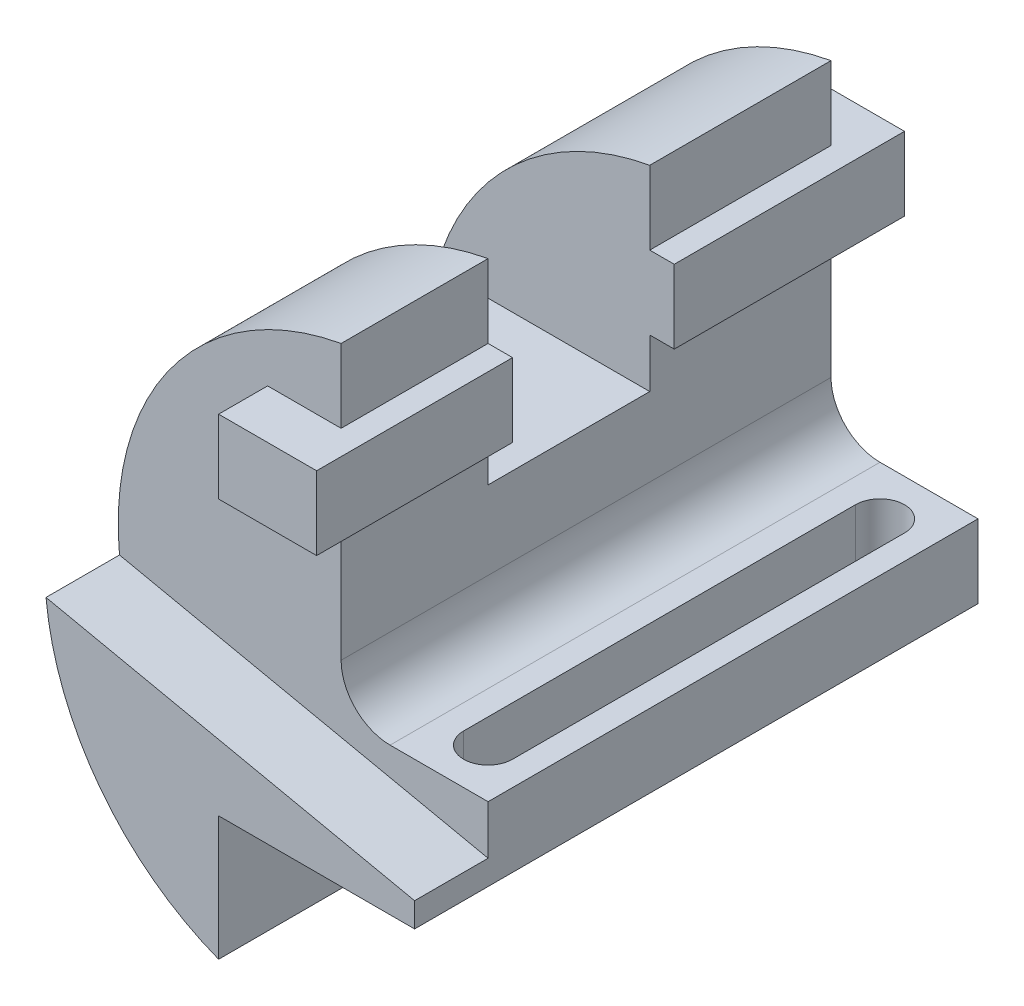
ISO-10303-21;
HEADER;
FILE_DESCRIPTION(('STEP AP214'),'2;1');
FILE_NAME('part.step','',(''),(''),'','','');
FILE_SCHEMA(('AUTOMOTIVE_DESIGN { 1 0 10303 214 1 1 1 1 }'));
ENDSEC;
DATA;
#1=APPLICATION_CONTEXT('core data for automotive mechanical design processes');
#2=APPLICATION_PROTOCOL_DEFINITION('international standard','automotive_design',2000,#1);
#3=PRODUCT_CONTEXT('',#1,'mechanical');
#4=PRODUCT('Part','Part','',(#3));
#5=PRODUCT_RELATED_PRODUCT_CATEGORY('part','',(#4));
#6=PRODUCT_DEFINITION_FORMATION('','',#4);
#7=PRODUCT_DEFINITION_CONTEXT('part definition',#1,'design');
#8=PRODUCT_DEFINITION('design','',#6,#7);
#9=PRODUCT_DEFINITION_SHAPE('','',#8);
#10=(LENGTH_UNIT() NAMED_UNIT(*) SI_UNIT(.MILLI.,.METRE.));
#11=(NAMED_UNIT(*) PLANE_ANGLE_UNIT() SI_UNIT($,.RADIAN.));
#12=(NAMED_UNIT(*) SI_UNIT($,.STERADIAN.) SOLID_ANGLE_UNIT());
#13=UNCERTAINTY_MEASURE_WITH_UNIT(LENGTH_MEASURE(1.E-05),#10,'distance_accuracy_value','');
#14=(GEOMETRIC_REPRESENTATION_CONTEXT(3) GLOBAL_UNCERTAINTY_ASSIGNED_CONTEXT((#13)) GLOBAL_UNIT_ASSIGNED_CONTEXT((#10,
#11,#12)) REPRESENTATION_CONTEXT('',''));
#15=CARTESIAN_POINT('',(0.,0.,0.));
#16=DIRECTION('',(0.,0.,1.));
#17=DIRECTION('',(1.,0.,0.));
#18=AXIS2_PLACEMENT_3D('',#15,#16,#17);
#19=CARTESIAN_POINT('',(-30.,25.0000000000001,115.));
#20=DIRECTION('',(-1.,0.,0.));
#21=DIRECTION('',(0.,0.,1.));
#22=AXIS2_PLACEMENT_3D('',#19,#20,#21);
#23=PLANE('',#22);
#24=DIRECTION('',(0.,0.,1.));
#25=VECTOR('',#24,1.);
#26=CARTESIAN_POINT('',(-30.,66.,115.));
#27=LINE('',#26,#25);
#28=CARTESIAN_POINT('',(-30.,66.,70.));
#29=VERTEX_POINT('',#28);
#30=CARTESIAN_POINT('',(-30.,66.,100.));
#31=VERTEX_POINT('',#30);
#32=EDGE_CURVE('E328',#29,#31,#27,.T.);
#33=ORIENTED_EDGE('',*,*,#32,.F.);
#34=DIRECTION('',(0.,1.,0.));
#35=VECTOR('',#34,1.);
#36=CARTESIAN_POINT('',(-30.,25.0000000000001,70.));
#37=LINE('',#36,#35);
#38=CARTESIAN_POINT('',(-30.0000000000001,81.,70.));
#39=VERTEX_POINT('',#38);
#40=EDGE_CURVE('E276',#29,#39,#37,.T.);
#41=ORIENTED_EDGE('',*,*,#40,.T.);
#42=DIRECTION('',(0.,0.,-1.));
#43=VECTOR('',#42,1.);
#44=CARTESIAN_POINT('',(-30.,81.,115.));
#45=LINE('',#44,#43);
#46=CARTESIAN_POINT('',(-30.,81.,100.));
#47=VERTEX_POINT('',#46);
#48=EDGE_CURVE('E405',#47,#39,#45,.T.);
#49=ORIENTED_EDGE('',*,*,#48,.F.);
#50=DIRECTION('',(0.,1.,0.));
#51=VECTOR('',#50,1.);
#52=CARTESIAN_POINT('',(-30.,25.0000000000001,100.));
#53=LINE('',#52,#51);
#54=EDGE_CURVE('E352',#31,#47,#53,.T.);
#55=ORIENTED_EDGE('',*,*,#54,.F.);
#56=EDGE_LOOP('',(#33,#41,#49,#55));
#57=FACE_BOUND('',#56,.T.);
#58=ADVANCED_FACE('F39',(#57),#23,.F.);
#59=CARTESIAN_POINT('',(-25.,66.,-10.));
#60=DIRECTION('',(-1.,0.,0.));
#61=DIRECTION('',(0.,-1.,0.));
#62=AXIS2_PLACEMENT_3D('',#59,#60,#61);
#63=PLANE('',#62);
#64=DIRECTION('',(0.,0.,1.));
#65=VECTOR('',#64,1.);
#66=CARTESIAN_POINT('',(-25.,51.,-10.));
#67=LINE('',#66,#65);
#68=CARTESIAN_POINT('',(-25.,51.,70.));
#69=VERTEX_POINT('',#68);
#70=CARTESIAN_POINT('',(-25.,51.,110.));
#71=VERTEX_POINT('',#70);
#72=EDGE_CURVE('E324',#69,#71,#67,.T.);
#73=ORIENTED_EDGE('',*,*,#72,.F.);
#74=DIRECTION('',(0.,1.,0.));
#75=VECTOR('',#74,1.);
#76=CARTESIAN_POINT('',(-25.,66.,70.));
#77=LINE('',#76,#75);
#78=CARTESIAN_POINT('',(-25.,66.,70.));
#79=VERTEX_POINT('',#78);
#80=EDGE_CURVE('E273',#69,#79,#77,.T.);
#81=ORIENTED_EDGE('',*,*,#80,.T.);
#82=DIRECTION('',(0.,0.,1.));
#83=VECTOR('',#82,1.);
#84=CARTESIAN_POINT('',(-25.,66.,-10.));
#85=LINE('',#84,#83);
#86=CARTESIAN_POINT('',(-25.,66.,110.));
#87=VERTEX_POINT('',#86);
#88=EDGE_CURVE('E312',#79,#87,#85,.T.);
#89=ORIENTED_EDGE('',*,*,#88,.T.);
#90=DIRECTION('',(0.,1.,0.));
#91=VECTOR('',#90,1.);
#92=CARTESIAN_POINT('',(-25.,66.,110.));
#93=LINE('',#92,#91);
#94=EDGE_CURVE('E297',#71,#87,#93,.T.);
#95=ORIENTED_EDGE('',*,*,#94,.F.);
#96=EDGE_LOOP('',(#73,#81,#89,#95));
#97=FACE_BOUND('',#96,.T.);
#98=ADVANCED_FACE('F455',(#97),#63,.F.);
#99=CARTESIAN_POINT('',(-25.,51.,-10.));
#100=DIRECTION('',(0.,1.,0.));
#101=DIRECTION('',(0.,0.,1.));
#102=AXIS2_PLACEMENT_3D('',#99,#100,#101);
#103=PLANE('',#102);
#104=DIRECTION('',(0.,0.,-1.));
#105=VECTOR('',#104,1.);
#106=CARTESIAN_POINT('',(-30.,51.,115.));
#107=LINE('',#106,#105);
#108=CARTESIAN_POINT('',(-30.,51.,100.));
#109=VERTEX_POINT('',#108);
#110=CARTESIAN_POINT('',(-30.,51.,70.));
#111=VERTEX_POINT('',#110);
#112=EDGE_CURVE('E339',#109,#111,#107,.T.);
#113=ORIENTED_EDGE('',*,*,#112,.T.);
#114=DIRECTION('',(1.,0.,0.));
#115=VECTOR('',#114,1.);
#116=CARTESIAN_POINT('',(-25.,51.,70.));
#117=LINE('',#116,#115);
#118=EDGE_CURVE('E279',#111,#69,#117,.T.);
#119=ORIENTED_EDGE('',*,*,#118,.T.);
#120=ORIENTED_EDGE('',*,*,#72,.T.);
#121=DIRECTION('',(1.,0.,0.));
#122=VECTOR('',#121,1.);
#123=CARTESIAN_POINT('',(-25.,51.,110.));
#124=LINE('',#123,#122);
#125=CARTESIAN_POINT('',(-45.,51.,110.));
#126=VERTEX_POINT('',#125);
#127=EDGE_CURVE('E300',#126,#71,#124,.T.);
#128=ORIENTED_EDGE('',*,*,#127,.F.);
#129=DIRECTION('',(0.,0.,1.));
#130=VECTOR('',#129,1.);
#131=CARTESIAN_POINT('',(-45.,51.,-10.));
#132=LINE('',#131,#130);
#133=CARTESIAN_POINT('',(-45.,51.,100.));
#134=VERTEX_POINT('',#133);
#135=EDGE_CURVE('E320',#134,#126,#132,.T.);
#136=ORIENTED_EDGE('',*,*,#135,.F.);
#137=DIRECTION('',(-1.,0.,0.));
#138=VECTOR('',#137,1.);
#139=CARTESIAN_POINT('',(-20.,51.,100.));
#140=LINE('',#139,#138);
#141=EDGE_CURVE('E420',#109,#134,#140,.T.);
#142=ORIENTED_EDGE('',*,*,#141,.F.);
#143=EDGE_LOOP('',(#113,#119,#120,#128,#136,#142));
#144=FACE_BOUND('',#143,.T.);
#145=ADVANCED_FACE('F463',(#144),#103,.F.);
#146=CARTESIAN_POINT('',(-25.,66.,-10.));
#147=DIRECTION('',(0.,-1.,0.));
#148=DIRECTION('',(0.,0.,-1.));
#149=AXIS2_PLACEMENT_3D('',#146,#147,#148);
#150=PLANE('',#149);
#151=ORIENTED_EDGE('',*,*,#88,.F.);
#152=DIRECTION('',(-1.,0.,0.));
#153=VECTOR('',#152,1.);
#154=CARTESIAN_POINT('',(-25.,66.,70.));
#155=LINE('',#154,#153);
#156=EDGE_CURVE('E426',#79,#29,#155,.T.);
#157=ORIENTED_EDGE('',*,*,#156,.T.);
#158=ORIENTED_EDGE('',*,*,#32,.T.);
#159=DIRECTION('',(1.,0.,0.));
#160=VECTOR('',#159,1.);
#161=CARTESIAN_POINT('',(-20.,66.,100.));
#162=LINE('',#161,#160);
#163=CARTESIAN_POINT('',(-45.,66.,100.));
#164=VERTEX_POINT('',#163);
#165=EDGE_CURVE('E414',#164,#31,#162,.T.);
#166=ORIENTED_EDGE('',*,*,#165,.F.);
#167=DIRECTION('',(0.,0.,1.));
#168=VECTOR('',#167,1.);
#169=CARTESIAN_POINT('',(-45.,66.,-10.));
#170=LINE('',#169,#168);
#171=CARTESIAN_POINT('',(-45.,66.,110.));
#172=VERTEX_POINT('',#171);
#173=EDGE_CURVE('E316',#164,#172,#170,.T.);
#174=ORIENTED_EDGE('',*,*,#173,.T.);
#175=DIRECTION('',(-1.,0.,0.));
#176=VECTOR('',#175,1.);
#177=CARTESIAN_POINT('',(-25.,66.,110.));
#178=LINE('',#177,#176);
#179=EDGE_CURVE('E294',#87,#172,#178,.T.);
#180=ORIENTED_EDGE('',*,*,#179,.F.);
#181=EDGE_LOOP('',(#151,#157,#158,#166,#174,#180));
#182=FACE_BOUND('',#181,.T.);
#183=ADVANCED_FACE('F474',(#182),#150,.F.);
#184=DIRECTION('',(0.,0.,1.));
#185=VECTOR('',#184,1.);
#186=CARTESIAN_POINT('',(-30.,41.,115.));
#187=LINE('',#186,#185);
#188=CARTESIAN_POINT('',(-30.,41.,37.));
#189=VERTEX_POINT('',#188);
#190=CARTESIAN_POINT('',(-30.,41.,70.));
#191=VERTEX_POINT('',#190);
#192=EDGE_CURVE('E288',#189,#191,#187,.T.);
#193=ORIENTED_EDGE('',*,*,#192,.T.);
#194=DIRECTION('',(0.,1.,0.));
#195=VECTOR('',#194,1.);
#196=CARTESIAN_POINT('',(-30.,25.0000000000001,70.));
#197=LINE('',#196,#195);
#198=EDGE_CURVE('E285',#191,#111,#197,.T.);
#199=ORIENTED_EDGE('',*,*,#198,.T.);
#200=ORIENTED_EDGE('',*,*,#112,.F.);
#201=CARTESIAN_POINT('',(-30.,25.0000000000001,100.));
#202=VERTEX_POINT('',#201);
#203=EDGE_CURVE('E353',#202,#109,#53,.T.);
#204=ORIENTED_EDGE('',*,*,#203,.F.);
#205=DIRECTION('',(0.,0.,-1.));
#206=VECTOR('',#205,1.);
#207=CARTESIAN_POINT('',(-30.,25.0000000000001,115.));
#208=LINE('',#207,#206);
#209=CARTESIAN_POINT('',(-30.,25.0000000000001,0.));
#210=VERTEX_POINT('',#209);
#211=EDGE_CURVE('E408',#202,#210,#208,.T.);
#212=ORIENTED_EDGE('',*,*,#211,.T.);
#213=DIRECTION('',(0.,1.,0.));
#214=VECTOR('',#213,1.);
#215=CARTESIAN_POINT('',(-30.,25.0000000000001,0.));
#216=LINE('',#215,#214);
#217=CARTESIAN_POINT('',(-30.,51.,0.));
#218=VERTEX_POINT('',#217);
#219=EDGE_CURVE('E388',#210,#218,#216,.T.);
#220=ORIENTED_EDGE('',*,*,#219,.T.);
#221=CARTESIAN_POINT('',(-30.,51.,37.));
#222=VERTEX_POINT('',#221);
#223=EDGE_CURVE('E338',#222,#218,#107,.T.);
#224=ORIENTED_EDGE('',*,*,#223,.F.);
#225=DIRECTION('',(0.,-1.,0.));
#226=VECTOR('',#225,1.);
#227=CARTESIAN_POINT('',(-30.,25.0000000000001,37.));
#228=LINE('',#227,#226);
#229=EDGE_CURVE('E270',#222,#189,#228,.T.);
#230=ORIENTED_EDGE('',*,*,#229,.T.);
#231=EDGE_LOOP('',(#193,#199,#200,#204,#212,#220,#224,#230));
#232=FACE_BOUND('',#231,.T.);
#233=ADVANCED_FACE('F459',(#232),#23,.F.);
#234=CARTESIAN_POINT('',(-30.0000000000001,81.,37.));
#235=VERTEX_POINT('',#234);
#236=CARTESIAN_POINT('',(-30.,81.,0.));
#237=VERTEX_POINT('',#236);
#238=EDGE_CURVE('E404',#235,#237,#45,.T.);
#239=ORIENTED_EDGE('',*,*,#238,.F.);
#240=DIRECTION('',(0.,-1.,0.));
#241=VECTOR('',#240,1.);
#242=CARTESIAN_POINT('',(-30.,25.0000000000001,37.));
#243=LINE('',#242,#241);
#244=CARTESIAN_POINT('',(-30.,66.,37.));
#245=VERTEX_POINT('',#244);
#246=EDGE_CURVE('E261',#235,#245,#243,.T.);
#247=ORIENTED_EDGE('',*,*,#246,.T.);
#248=CARTESIAN_POINT('',(-30.,66.,0.));
#249=VERTEX_POINT('',#248);
#250=EDGE_CURVE('E329',#249,#245,#27,.T.);
#251=ORIENTED_EDGE('',*,*,#250,.F.);
#252=EDGE_CURVE('E387',#249,#237,#216,.T.);
#253=ORIENTED_EDGE('',*,*,#252,.T.);
#254=EDGE_LOOP('',(#239,#247,#251,#253));
#255=FACE_BOUND('',#254,.T.);
#256=ADVANCED_FACE('F458',(#255),#23,.F.);
#257=CARTESIAN_POINT('',(-20.,25.,0.));
#258=DIRECTION('',(0.,0.,-1.));
#259=DIRECTION('',(-1.,0.,0.));
#260=AXIS2_PLACEMENT_3D('',#257,#258,#259);
#261=PLANE('',#260);
#262=DIRECTION('',(0.,-1.,0.));
#263=VECTOR('',#262,1.);
#264=CARTESIAN_POINT('',(-45.,25.,0.));
#265=LINE('',#264,#263);
#266=CARTESIAN_POINT('',(-45.,66.,0.));
#267=VERTEX_POINT('',#266);
#268=CARTESIAN_POINT('',(-45.,51.,0.));
#269=VERTEX_POINT('',#268);
#270=EDGE_CURVE('E335',#267,#269,#265,.T.);
#271=ORIENTED_EDGE('',*,*,#270,.T.);
#272=DIRECTION('',(1.,0.,0.));
#273=VECTOR('',#272,1.);
#274=CARTESIAN_POINT('',(-20.,51.,0.));
#275=LINE('',#274,#273);
#276=EDGE_CURVE('E342',#269,#218,#275,.T.);
#277=ORIENTED_EDGE('',*,*,#276,.T.);
#278=ORIENTED_EDGE('',*,*,#219,.F.);
#279=CARTESIAN_POINT('',(-20.,25.,0.));
#280=DIRECTION('',(0.,0.,-1.));
#281=DIRECTION('',(-1.,0.,0.));
#282=AXIS2_PLACEMENT_3D('',#279,#280,#281);
#283=CIRCLE('',#282,10.);
#284=CARTESIAN_POINT('',(-19.9999999999999,15.,0.));
#285=VERTEX_POINT('',#284);
#286=EDGE_CURVE('E384',#285,#210,#283,.T.);
#287=ORIENTED_EDGE('',*,*,#286,.F.);
#288=DIRECTION('',(-1.,0.,0.));
#289=VECTOR('',#288,1.);
#290=CARTESIAN_POINT('',(0.,15.,0.));
#291=LINE('',#290,#289);
#292=CARTESIAN_POINT('',(0.,15.,0.));
#293=VERTEX_POINT('',#292);
#294=EDGE_CURVE('E381',#293,#285,#291,.T.);
#295=ORIENTED_EDGE('',*,*,#294,.F.);
#296=DIRECTION('',(0.,1.,0.));
#297=VECTOR('',#296,1.);
#298=CARTESIAN_POINT('',(0.,0.,0.));
#299=LINE('',#298,#297);
#300=CARTESIAN_POINT('',(0.,0.,0.));
#301=VERTEX_POINT('',#300);
#302=EDGE_CURVE('E366',#301,#293,#299,.T.);
#303=ORIENTED_EDGE('',*,*,#302,.F.);
#304=DIRECTION('',(1.,0.,0.));
#305=VECTOR('',#304,1.);
#306=CARTESIAN_POINT('',(0.,0.,0.));
#307=LINE('',#306,#305);
#308=CARTESIAN_POINT('',(-40.,0.,0.));
#309=VERTEX_POINT('',#308);
#310=EDGE_CURVE('E372',#309,#301,#307,.T.);
#311=ORIENTED_EDGE('',*,*,#310,.F.);
#312=DIRECTION('',(0.,1.,0.));
#313=VECTOR('',#312,1.);
#314=CARTESIAN_POINT('',(-40.,0.,0.));
#315=LINE('',#314,#313);
#316=CARTESIAN_POINT('',(-40.,-25.3627969821569,0.));
#317=VERTEX_POINT('',#316);
#318=EDGE_CURVE('E393',#317,#309,#315,.T.);
#319=ORIENTED_EDGE('',*,*,#318,.F.);
#320=CARTESIAN_POINT('',(-20.,26.4083339693685,0.));
#321=DIRECTION('',(0.,0.,1.));
#322=DIRECTION('',(-1.,0.,0.));
#323=AXIS2_PLACEMENT_3D('',#320,#321,#322);
#324=CIRCLE('',#323,55.5);
#325=EDGE_CURVE('E391',#237,#317,#324,.T.);
#326=ORIENTED_EDGE('',*,*,#325,.F.);
#327=ORIENTED_EDGE('',*,*,#252,.F.);
#328=DIRECTION('',(-1.,0.,0.));
#329=VECTOR('',#328,1.);
#330=CARTESIAN_POINT('',(-20.,66.,0.));
#331=LINE('',#330,#329);
#332=EDGE_CURVE('E332',#249,#267,#331,.T.);
#333=ORIENTED_EDGE('',*,*,#332,.T.);
#334=EDGE_LOOP('',(#271,#277,#278,#287,#295,#303,#311,#319,#326,#327,#333));
#335=FACE_BOUND('',#334,.T.);
#336=ADVANCED_FACE('F471',(#335),#261,.T.);
#337=CARTESIAN_POINT('',(-20.,25.,100.));
#338=DIRECTION('',(0.,0.,1.));
#339=DIRECTION('',(1.,0.,0.));
#340=AXIS2_PLACEMENT_3D('',#337,#338,#339);
#341=PLANE('',#340);
#342=ORIENTED_EDGE('',*,*,#203,.T.);
#343=ORIENTED_EDGE('',*,*,#141,.T.);
#344=DIRECTION('',(0.,1.,0.));
#345=VECTOR('',#344,1.);
#346=CARTESIAN_POINT('',(-45.,25.,100.));
#347=LINE('',#346,#345);
#348=EDGE_CURVE('E417',#134,#164,#347,.T.);
#349=ORIENTED_EDGE('',*,*,#348,.T.);
#350=ORIENTED_EDGE('',*,*,#165,.T.);
#351=ORIENTED_EDGE('',*,*,#54,.T.);
#352=CARTESIAN_POINT('',(-20.,26.4083339693685,100.));
#353=DIRECTION('',(0.,0.,1.));
#354=DIRECTION('',(1.,0.,0.));
#355=AXIS2_PLACEMENT_3D('',#352,#353,#354);
#356=CIRCLE('',#355,55.5);
#357=CARTESIAN_POINT('',(-75.2350441418964,20.9917022998936,100.));
#358=VERTEX_POINT('',#357);
#359=EDGE_CURVE('E356',#47,#358,#356,.T.);
#360=ORIENTED_EDGE('',*,*,#359,.T.);
#361=DIRECTION('',(0.978147600733806,-0.207911690817756,0.));
#362=VECTOR('',#361,1.);
#363=CARTESIAN_POINT('',(0.,4.99999999999999,100.));
#364=LINE('',#363,#362);
#365=CARTESIAN_POINT('',(0.,4.99999999999999,100.));
#366=VERTEX_POINT('',#365);
#367=EDGE_CURVE('E358',#358,#366,#364,.T.);
#368=ORIENTED_EDGE('',*,*,#367,.T.);
#369=DIRECTION('',(0.,1.,0.));
#370=VECTOR('',#369,1.);
#371=CARTESIAN_POINT('',(0.,4.99999999999999,100.));
#372=LINE('',#371,#370);
#373=CARTESIAN_POINT('',(0.,15.,100.));
#374=VERTEX_POINT('',#373);
#375=EDGE_CURVE('E346',#366,#374,#372,.T.);
#376=ORIENTED_EDGE('',*,*,#375,.T.);
#377=DIRECTION('',(-1.,0.,0.));
#378=VECTOR('',#377,1.);
#379=CARTESIAN_POINT('',(0.,15.,100.));
#380=LINE('',#379,#378);
#381=CARTESIAN_POINT('',(-19.9999999999999,15.,100.));
#382=VERTEX_POINT('',#381);
#383=EDGE_CURVE('E348',#374,#382,#380,.T.);
#384=ORIENTED_EDGE('',*,*,#383,.T.);
#385=CARTESIAN_POINT('',(-20.,25.,100.));
#386=DIRECTION('',(0.,0.,-1.));
#387=DIRECTION('',(1.,0.,0.));
#388=AXIS2_PLACEMENT_3D('',#385,#386,#387);
#389=CIRCLE('',#388,10.);
#390=EDGE_CURVE('E350',#382,#202,#389,.T.);
#391=ORIENTED_EDGE('',*,*,#390,.T.);
#392=EDGE_LOOP('',(#342,#343,#349,#350,#351,#360,#368,#376,#384,#391));
#393=FACE_BOUND('',#392,.T.);
#394=ADVANCED_FACE('F517',(#393),#341,.T.);
#395=CARTESIAN_POINT('',(0.,15.,115.));
#396=DIRECTION('',(0.,-1.,0.));
#397=DIRECTION('',(1.,0.,0.));
#398=AXIS2_PLACEMENT_3D('',#395,#396,#397);
#399=PLANE('',#398);
#400=DIRECTION('',(0.,0.,1.));
#401=VECTOR('',#400,1.);
#402=CARTESIAN_POINT('',(-15.,15.,10.));
#403=LINE('',#402,#401);
#404=CARTESIAN_POINT('',(-15.,15.,10.));
#405=VERTEX_POINT('',#404);
#406=CARTESIAN_POINT('',(-15.,15.,90.));
#407=VERTEX_POINT('',#406);
#408=EDGE_CURVE('E236',#405,#407,#403,.T.);
#409=ORIENTED_EDGE('',*,*,#408,.F.);
#410=CARTESIAN_POINT('',(-10.,15.,10.));
#411=DIRECTION('',(0.,1.,0.));
#412=DIRECTION('',(-1.,0.,0.));
#413=AXIS2_PLACEMENT_3D('',#410,#411,#412);
#414=CIRCLE('',#413,5.);
#415=CARTESIAN_POINT('',(-5.,15.,10.));
#416=VERTEX_POINT('',#415);
#417=EDGE_CURVE('E54',#416,#405,#414,.T.);
#418=ORIENTED_EDGE('',*,*,#417,.F.);
#419=DIRECTION('',(0.,0.,-1.));
#420=VECTOR('',#419,1.);
#421=CARTESIAN_POINT('',(-5.,15.,10.));
#422=LINE('',#421,#420);
#423=CARTESIAN_POINT('',(-4.99999999999999,15.,90.));
#424=VERTEX_POINT('',#423);
#425=EDGE_CURVE('E243',#424,#416,#422,.T.);
#426=ORIENTED_EDGE('',*,*,#425,.F.);
#427=CARTESIAN_POINT('',(-9.99999999999999,15.,90.));
#428=DIRECTION('',(0.,1.,0.));
#429=DIRECTION('',(-1.,0.,0.));
#430=AXIS2_PLACEMENT_3D('',#427,#428,#429);
#431=CIRCLE('',#430,5.);
#432=EDGE_CURVE('E227',#407,#424,#431,.T.);
#433=ORIENTED_EDGE('',*,*,#432,.F.);
#434=EDGE_LOOP('',(#409,#418,#426,#433));
#435=FACE_BOUND('',#434,.T.);
#436=ORIENTED_EDGE('',*,*,#383,.F.);
#437=DIRECTION('',(0.,0.,-1.));
#438=VECTOR('',#437,1.);
#439=CARTESIAN_POINT('',(0.,15.,115.));
#440=LINE('',#439,#438);
#441=EDGE_CURVE('E412',#374,#293,#440,.T.);
#442=ORIENTED_EDGE('',*,*,#441,.T.);
#443=ORIENTED_EDGE('',*,*,#294,.T.);
#444=DIRECTION('',(0.,0.,-1.));
#445=VECTOR('',#444,1.);
#446=CARTESIAN_POINT('',(-19.9999999999999,15.,115.));
#447=LINE('',#446,#445);
#448=EDGE_CURVE('E410',#382,#285,#447,.T.);
#449=ORIENTED_EDGE('',*,*,#448,.F.);
#450=EDGE_LOOP('',(#436,#442,#443,#449));
#451=FACE_BOUND('',#450,.T.);
#452=ADVANCED_FACE('F240',(#435,#451),#399,.F.);
#453=CARTESIAN_POINT('',(-20.,25.,115.));
#454=DIRECTION('',(0.,0.,-1.));
#455=DIRECTION('',(-1.,0.,0.));
#456=AXIS2_PLACEMENT_3D('',#453,#454,#455);
#457=CYLINDRICAL_SURFACE('',#456,10.);
#458=ORIENTED_EDGE('',*,*,#390,.F.);
#459=ORIENTED_EDGE('',*,*,#448,.T.);
#460=ORIENTED_EDGE('',*,*,#286,.T.);
#461=ORIENTED_EDGE('',*,*,#211,.F.);
#462=EDGE_LOOP('',(#458,#459,#460,#461));
#463=FACE_BOUND('',#462,.T.);
#464=ADVANCED_FACE('F530',(#463),#457,.F.);
#465=CARTESIAN_POINT('',(0.,0.,115.));
#466=DIRECTION('',(-1.,0.,0.));
#467=DIRECTION('',(0.,0.,1.));
#468=AXIS2_PLACEMENT_3D('',#465,#466,#467);
#469=PLANE('',#468);
#470=ORIENTED_EDGE('',*,*,#375,.F.);
#471=DIRECTION('',(0.,0.,1.));
#472=VECTOR('',#471,1.);
#473=CARTESIAN_POINT('',(0.,4.99999999999999,100.));
#474=LINE('',#473,#472);
#475=CARTESIAN_POINT('',(0.,4.99999999999999,115.));
#476=VERTEX_POINT('',#475);
#477=EDGE_CURVE('E363',#366,#476,#474,.T.);
#478=ORIENTED_EDGE('',*,*,#477,.T.);
#479=DIRECTION('',(0.,1.,0.));
#480=VECTOR('',#479,1.);
#481=CARTESIAN_POINT('',(0.,0.,115.));
#482=LINE('',#481,#480);
#483=CARTESIAN_POINT('',(0.,0.,115.));
#484=VERTEX_POINT('',#483);
#485=EDGE_CURVE('E368',#484,#476,#482,.T.);
#486=ORIENTED_EDGE('',*,*,#485,.F.);
#487=DIRECTION('',(0.,0.,-1.));
#488=VECTOR('',#487,1.);
#489=CARTESIAN_POINT('',(0.,0.,115.));
#490=LINE('',#489,#488);
#491=EDGE_CURVE('E378',#484,#301,#490,.T.);
#492=ORIENTED_EDGE('',*,*,#491,.T.);
#493=ORIENTED_EDGE('',*,*,#302,.T.);
#494=ORIENTED_EDGE('',*,*,#441,.F.);
#495=EDGE_LOOP('',(#470,#478,#486,#492,#493,#494));
#496=FACE_BOUND('',#495,.T.);
#497=ADVANCED_FACE('F41',(#496),#469,.F.);
#498=CARTESIAN_POINT('',(-20.,26.4083339693685,115.));
#499=DIRECTION('',(0.,0.,-1.));
#500=DIRECTION('',(-1.,0.,0.));
#501=AXIS2_PLACEMENT_3D('',#498,#499,#500);
#502=CYLINDRICAL_SURFACE('',#501,55.5);
#503=ORIENTED_EDGE('',*,*,#48,.T.);
#504=CARTESIAN_POINT('',(-20.,26.4083339693685,70.));
#505=DIRECTION('',(0.,0.,1.));
#506=DIRECTION('',(1.,0.,0.));
#507=AXIS2_PLACEMENT_3D('',#504,#505,#506);
#508=CIRCLE('',#507,55.5);
#509=CARTESIAN_POINT('',(-73.5474862383895,41.,70.));
#510=VERTEX_POINT('',#509);
#511=EDGE_CURVE('E282',#39,#510,#508,.T.);
#512=ORIENTED_EDGE('',*,*,#511,.T.);
#513=DIRECTION('',(0.,0.,-1.));
#514=VECTOR('',#513,1.);
#515=CARTESIAN_POINT('',(-73.5474862383895,41.,115.));
#516=LINE('',#515,#514);
#517=CARTESIAN_POINT('',(-73.5474862383895,41.,37.));
#518=VERTEX_POINT('',#517);
#519=EDGE_CURVE('E429',#510,#518,#516,.T.);
#520=ORIENTED_EDGE('',*,*,#519,.T.);
#521=CARTESIAN_POINT('',(-20.,26.4083339693685,37.));
#522=DIRECTION('',(0.,0.,-1.));
#523=DIRECTION('',(0.,1.,0.));
#524=AXIS2_PLACEMENT_3D('',#521,#522,#523);
#525=CIRCLE('',#524,55.5);
#526=EDGE_CURVE('E267',#518,#235,#525,.T.);
#527=ORIENTED_EDGE('',*,*,#526,.T.);
#528=ORIENTED_EDGE('',*,*,#238,.T.);
#529=ORIENTED_EDGE('',*,*,#325,.T.);
#530=DIRECTION('',(0.,0.,-1.));
#531=VECTOR('',#530,1.);
#532=CARTESIAN_POINT('',(-40.,-25.3627969821569,115.));
#533=LINE('',#532,#531);
#534=CARTESIAN_POINT('',(-40.,-25.3627969821569,115.));
#535=VERTEX_POINT('',#534);
#536=EDGE_CURVE('E401',#535,#317,#533,.T.);
#537=ORIENTED_EDGE('',*,*,#536,.F.);
#538=CARTESIAN_POINT('',(-20.,26.4083339693685,115.));
#539=DIRECTION('',(0.,0.,1.));
#540=DIRECTION('',(-1.,0.,0.));
#541=AXIS2_PLACEMENT_3D('',#538,#539,#540);
#542=CIRCLE('',#541,55.5);
#543=CARTESIAN_POINT('',(-75.2350441418964,20.9917022998936,115.));
#544=VERTEX_POINT('',#543);
#545=EDGE_CURVE('E371',#544,#535,#542,.T.);
#546=ORIENTED_EDGE('',*,*,#545,.F.);
#547=DIRECTION('',(0.,0.,1.));
#548=VECTOR('',#547,1.);
#549=CARTESIAN_POINT('',(-75.2350441418964,20.9917022998936,100.));
#550=LINE('',#549,#548);
#551=EDGE_CURVE('E361',#358,#544,#550,.T.);
#552=ORIENTED_EDGE('',*,*,#551,.F.);
#553=ORIENTED_EDGE('',*,*,#359,.F.);
#554=EDGE_LOOP('',(#503,#512,#520,#527,#528,#529,#537,#546,#552,#553));
#555=FACE_BOUND('',#554,.T.);
#556=ADVANCED_FACE('F490',(#555),#502,.T.);
#557=CARTESIAN_POINT('',(-40.,0.,115.));
#558=DIRECTION('',(-1.,0.,0.));
#559=DIRECTION('',(0.,-1.,0.));
#560=AXIS2_PLACEMENT_3D('',#557,#558,#559);
#561=PLANE('',#560);
#562=ORIENTED_EDGE('',*,*,#318,.T.);
#563=DIRECTION('',(0.,0.,-1.));
#564=VECTOR('',#563,1.);
#565=CARTESIAN_POINT('',(-40.,0.,115.));
#566=LINE('',#565,#564);
#567=CARTESIAN_POINT('',(-40.,0.,115.));
#568=VERTEX_POINT('',#567);
#569=EDGE_CURVE('E398',#568,#309,#566,.T.);
#570=ORIENTED_EDGE('',*,*,#569,.F.);
#571=DIRECTION('',(0.,1.,0.));
#572=VECTOR('',#571,1.);
#573=CARTESIAN_POINT('',(-40.,0.,115.));
#574=LINE('',#573,#572);
#575=EDGE_CURVE('E374',#535,#568,#574,.T.);
#576=ORIENTED_EDGE('',*,*,#575,.F.);
#577=ORIENTED_EDGE('',*,*,#536,.T.);
#578=EDGE_LOOP('',(#562,#570,#576,#577));
#579=FACE_BOUND('',#578,.T.);
#580=ADVANCED_FACE('F502',(#579),#561,.F.);
#581=CARTESIAN_POINT('',(0.,0.,115.));
#582=DIRECTION('',(0.,1.,0.));
#583=DIRECTION('',(-1.,0.,0.));
#584=AXIS2_PLACEMENT_3D('',#581,#582,#583);
#585=PLANE('',#584);
#586=DIRECTION('',(0.,0.,-1.));
#587=VECTOR('',#586,1.);
#588=CARTESIAN_POINT('',(-4.99999999999999,0.,115.));
#589=LINE('',#588,#587);
#590=CARTESIAN_POINT('',(-4.99999999999999,0.,90.));
#591=VERTEX_POINT('',#590);
#592=CARTESIAN_POINT('',(-5.,0.,10.));
#593=VERTEX_POINT('',#592);
#594=EDGE_CURVE('E47',#591,#593,#589,.T.);
#595=ORIENTED_EDGE('',*,*,#594,.T.);
#596=CARTESIAN_POINT('',(-10.,0.,10.));
#597=DIRECTION('',(0.,1.,0.));
#598=DIRECTION('',(-1.,0.,0.));
#599=AXIS2_PLACEMENT_3D('',#596,#597,#598);
#600=CIRCLE('',#599,5.);
#601=CARTESIAN_POINT('',(-15.,0.,10.));
#602=VERTEX_POINT('',#601);
#603=EDGE_CURVE('E12',#593,#602,#600,.T.);
#604=ORIENTED_EDGE('',*,*,#603,.T.);
#605=DIRECTION('',(0.,0.,1.));
#606=VECTOR('',#605,1.);
#607=CARTESIAN_POINT('',(-15.,0.,115.));
#608=LINE('',#607,#606);
#609=CARTESIAN_POINT('',(-15.,0.,90.));
#610=VERTEX_POINT('',#609);
#611=EDGE_CURVE('E432',#602,#610,#608,.T.);
#612=ORIENTED_EDGE('',*,*,#611,.T.);
#613=CARTESIAN_POINT('',(-9.99999999999999,0.,90.));
#614=DIRECTION('',(0.,1.,0.));
#615=DIRECTION('',(-1.,0.,0.));
#616=AXIS2_PLACEMENT_3D('',#613,#614,#615);
#617=CIRCLE('',#616,5.);
#618=EDGE_CURVE('E230',#610,#591,#617,.T.);
#619=ORIENTED_EDGE('',*,*,#618,.T.);
#620=EDGE_LOOP('',(#595,#604,#612,#619));
#621=FACE_BOUND('',#620,.T.);
#622=ORIENTED_EDGE('',*,*,#310,.T.);
#623=ORIENTED_EDGE('',*,*,#491,.F.);
#624=DIRECTION('',(1.,0.,0.));
#625=VECTOR('',#624,1.);
#626=CARTESIAN_POINT('',(0.,0.,115.));
#627=LINE('',#626,#625);
#628=EDGE_CURVE('E376',#568,#484,#627,.T.);
#629=ORIENTED_EDGE('',*,*,#628,.F.);
#630=ORIENTED_EDGE('',*,*,#569,.T.);
#631=EDGE_LOOP('',(#622,#623,#629,#630));
#632=FACE_BOUND('',#631,.T.);
#633=ADVANCED_FACE('F436',(#621,#632),#585,.F.);
#634=CARTESIAN_POINT('',(-20.,25.,115.));
#635=DIRECTION('',(0.,0.,-1.));
#636=DIRECTION('',(-1.,0.,0.));
#637=AXIS2_PLACEMENT_3D('',#634,#635,#636);
#638=PLANE('',#637);
#639=ORIENTED_EDGE('',*,*,#485,.T.);
#640=DIRECTION('',(0.978147600733806,-0.207911690817756,0.));
#641=VECTOR('',#640,1.);
#642=CARTESIAN_POINT('',(0.,4.99999999999999,115.));
#643=LINE('',#642,#641);
#644=EDGE_CURVE('E345',#544,#476,#643,.T.);
#645=ORIENTED_EDGE('',*,*,#644,.F.);
#646=ORIENTED_EDGE('',*,*,#545,.T.);
#647=ORIENTED_EDGE('',*,*,#575,.T.);
#648=ORIENTED_EDGE('',*,*,#628,.T.);
#649=EDGE_LOOP('',(#639,#645,#646,#647,#648));
#650=FACE_BOUND('',#649,.T.);
#651=ADVANCED_FACE('F506',(#650),#638,.F.);
#652=CARTESIAN_POINT('',(0.,4.99999999999999,100.));
#653=DIRECTION('',(-0.207911690817756,-0.978147600733806,0.));
#654=DIRECTION('',(0.978147600733806,-0.207911690817756,0.));
#655=AXIS2_PLACEMENT_3D('',#652,#653,#654);
#656=PLANE('',#655);
#657=ORIENTED_EDGE('',*,*,#644,.T.);
#658=ORIENTED_EDGE('',*,*,#477,.F.);
#659=ORIENTED_EDGE('',*,*,#367,.F.);
#660=ORIENTED_EDGE('',*,*,#551,.T.);
#661=EDGE_LOOP('',(#657,#658,#659,#660));
#662=FACE_BOUND('',#661,.T.);
#663=ADVANCED_FACE('F514',(#662),#656,.F.);
#664=CARTESIAN_POINT('',(-45.,66.,-10.));
#665=DIRECTION('',(1.,0.,0.));
#666=DIRECTION('',(0.,0.,-1.));
#667=AXIS2_PLACEMENT_3D('',#664,#665,#666);
#668=PLANE('',#667);
#669=ORIENTED_EDGE('',*,*,#270,.F.);
#670=CARTESIAN_POINT('',(-45.,66.,-10.));
#671=VERTEX_POINT('',#670);
#672=EDGE_CURVE('E317',#671,#267,#170,.T.);
#673=ORIENTED_EDGE('',*,*,#672,.F.);
#674=DIRECTION('',(0.,1.,0.));
#675=VECTOR('',#674,1.);
#676=CARTESIAN_POINT('',(-45.,66.,-10.));
#677=LINE('',#676,#675);
#678=CARTESIAN_POINT('',(-45.,51.,-10.));
#679=VERTEX_POINT('',#678);
#680=EDGE_CURVE('E308',#679,#671,#677,.T.);
#681=ORIENTED_EDGE('',*,*,#680,.F.);
#682=EDGE_CURVE('E321',#679,#269,#132,.T.);
#683=ORIENTED_EDGE('',*,*,#682,.T.);
#684=EDGE_LOOP('',(#669,#673,#681,#683));
#685=FACE_BOUND('',#684,.T.);
#686=ADVANCED_FACE('F565',(#685),#668,.F.);
#687=CARTESIAN_POINT('',(-25.,66.,-10.));
#688=VERTEX_POINT('',#687);
#689=CARTESIAN_POINT('',(-25.,66.,37.));
#690=VERTEX_POINT('',#689);
#691=EDGE_CURVE('E313',#688,#690,#85,.T.);
#692=ORIENTED_EDGE('',*,*,#691,.T.);
#693=DIRECTION('',(0.,-1.,0.));
#694=VECTOR('',#693,1.);
#695=CARTESIAN_POINT('',(-25.,66.,37.));
#696=LINE('',#695,#694);
#697=CARTESIAN_POINT('',(-25.,51.,37.));
#698=VERTEX_POINT('',#697);
#699=EDGE_CURVE('E256',#690,#698,#696,.T.);
#700=ORIENTED_EDGE('',*,*,#699,.T.);
#701=CARTESIAN_POINT('',(-25.,51.,-10.));
#702=VERTEX_POINT('',#701);
#703=EDGE_CURVE('E325',#702,#698,#67,.T.);
#704=ORIENTED_EDGE('',*,*,#703,.F.);
#705=DIRECTION('',(0.,-1.,0.));
#706=VECTOR('',#705,1.);
#707=CARTESIAN_POINT('',(-25.,66.,-10.));
#708=LINE('',#707,#706);
#709=EDGE_CURVE('E303',#688,#702,#708,.T.);
#710=ORIENTED_EDGE('',*,*,#709,.F.);
#711=EDGE_LOOP('',(#692,#700,#704,#710));
#712=FACE_BOUND('',#711,.T.);
#713=ADVANCED_FACE('F466',(#712),#63,.F.);
#714=ORIENTED_EDGE('',*,*,#703,.T.);
#715=DIRECTION('',(-1.,0.,0.));
#716=VECTOR('',#715,1.);
#717=CARTESIAN_POINT('',(-25.,51.,37.));
#718=LINE('',#717,#716);
#719=EDGE_CURVE('E264',#698,#222,#718,.T.);
#720=ORIENTED_EDGE('',*,*,#719,.T.);
#721=ORIENTED_EDGE('',*,*,#223,.T.);
#722=ORIENTED_EDGE('',*,*,#276,.F.);
#723=ORIENTED_EDGE('',*,*,#682,.F.);
#724=DIRECTION('',(-1.,0.,0.));
#725=VECTOR('',#724,1.);
#726=CARTESIAN_POINT('',(-25.,51.,-10.));
#727=LINE('',#726,#725);
#728=EDGE_CURVE('E306',#702,#679,#727,.T.);
#729=ORIENTED_EDGE('',*,*,#728,.F.);
#730=EDGE_LOOP('',(#714,#720,#721,#722,#723,#729));
#731=FACE_BOUND('',#730,.T.);
#732=ADVANCED_FACE('F564',(#731),#103,.F.);
#733=ORIENTED_EDGE('',*,*,#348,.F.);
#734=ORIENTED_EDGE('',*,*,#135,.T.);
#735=DIRECTION('',(0.,-1.,0.));
#736=VECTOR('',#735,1.);
#737=CARTESIAN_POINT('',(-45.,66.,110.));
#738=LINE('',#737,#736);
#739=EDGE_CURVE('E291',#172,#126,#738,.T.);
#740=ORIENTED_EDGE('',*,*,#739,.F.);
#741=ORIENTED_EDGE('',*,*,#173,.F.);
#742=EDGE_LOOP('',(#733,#734,#740,#741));
#743=FACE_BOUND('',#742,.T.);
#744=ADVANCED_FACE('F539',(#743),#668,.F.);
#745=ORIENTED_EDGE('',*,*,#250,.T.);
#746=DIRECTION('',(1.,0.,0.));
#747=VECTOR('',#746,1.);
#748=CARTESIAN_POINT('',(-25.,66.,37.));
#749=LINE('',#748,#747);
#750=EDGE_CURVE('E423',#245,#690,#749,.T.);
#751=ORIENTED_EDGE('',*,*,#750,.T.);
#752=ORIENTED_EDGE('',*,*,#691,.F.);
#753=DIRECTION('',(1.,0.,0.));
#754=VECTOR('',#753,1.);
#755=CARTESIAN_POINT('',(-25.,66.,-10.));
#756=LINE('',#755,#754);
#757=EDGE_CURVE('E310',#671,#688,#756,.T.);
#758=ORIENTED_EDGE('',*,*,#757,.F.);
#759=ORIENTED_EDGE('',*,*,#672,.T.);
#760=ORIENTED_EDGE('',*,*,#332,.F.);
#761=EDGE_LOOP('',(#745,#751,#752,#758,#759,#760));
#762=FACE_BOUND('',#761,.T.);
#763=ADVANCED_FACE('F481',(#762),#150,.F.);
#764=CARTESIAN_POINT('',(0.,0.,-10.));
#765=DIRECTION('',(0.,0.,-1.));
#766=DIRECTION('',(-1.,0.,0.));
#767=AXIS2_PLACEMENT_3D('',#764,#765,#766);
#768=PLANE('',#767);
#769=ORIENTED_EDGE('',*,*,#709,.T.);
#770=ORIENTED_EDGE('',*,*,#728,.T.);
#771=ORIENTED_EDGE('',*,*,#680,.T.);
#772=ORIENTED_EDGE('',*,*,#757,.T.);
#773=EDGE_LOOP('',(#769,#770,#771,#772));
#774=FACE_BOUND('',#773,.T.);
#775=ADVANCED_FACE('F556',(#774),#768,.T.);
#776=CARTESIAN_POINT('',(-20.,25.,110.));
#777=DIRECTION('',(0.,0.,-1.));
#778=DIRECTION('',(-1.,0.,0.));
#779=AXIS2_PLACEMENT_3D('',#776,#777,#778);
#780=PLANE('',#779);
#781=ORIENTED_EDGE('',*,*,#94,.T.);
#782=ORIENTED_EDGE('',*,*,#179,.T.);
#783=ORIENTED_EDGE('',*,*,#739,.T.);
#784=ORIENTED_EDGE('',*,*,#127,.T.);
#785=EDGE_LOOP('',(#781,#782,#783,#784));
#786=FACE_BOUND('',#785,.T.);
#787=ADVANCED_FACE('F544',(#786),#780,.F.);
#788=CARTESIAN_POINT('',(-75.5,41.,70.));
#789=DIRECTION('',(0.,-1.,0.));
#790=DIRECTION('',(0.,0.,-1.));
#791=AXIS2_PLACEMENT_3D('',#788,#789,#790);
#792=PLANE('',#791);
#793=DIRECTION('',(1.,0.,0.));
#794=VECTOR('',#793,1.);
#795=CARTESIAN_POINT('',(-75.5,41.,37.));
#796=LINE('',#795,#794);
#797=EDGE_CURVE('E253',#518,#189,#796,.T.);
#798=ORIENTED_EDGE('',*,*,#797,.F.);
#799=ORIENTED_EDGE('',*,*,#519,.F.);
#800=DIRECTION('',(1.,0.,0.));
#801=VECTOR('',#800,1.);
#802=CARTESIAN_POINT('',(-75.5,41.,70.));
#803=LINE('',#802,#801);
#804=EDGE_CURVE('E250',#510,#191,#803,.T.);
#805=ORIENTED_EDGE('',*,*,#804,.T.);
#806=ORIENTED_EDGE('',*,*,#192,.F.);
#807=EDGE_LOOP('',(#798,#799,#805,#806));
#808=FACE_BOUND('',#807,.T.);
#809=ADVANCED_FACE('F486',(#808),#792,.F.);
#810=CARTESIAN_POINT('',(-75.5,81.,70.));
#811=DIRECTION('',(0.,0.,1.));
#812=DIRECTION('',(1.,0.,0.));
#813=AXIS2_PLACEMENT_3D('',#810,#811,#812);
#814=PLANE('',#813);
#815=ORIENTED_EDGE('',*,*,#804,.F.);
#816=ORIENTED_EDGE('',*,*,#511,.F.);
#817=ORIENTED_EDGE('',*,*,#40,.F.);
#818=ORIENTED_EDGE('',*,*,#156,.F.);
#819=ORIENTED_EDGE('',*,*,#80,.F.);
#820=ORIENTED_EDGE('',*,*,#118,.F.);
#821=ORIENTED_EDGE('',*,*,#198,.F.);
#822=EDGE_LOOP('',(#815,#816,#817,#818,#819,#820,#821));
#823=FACE_BOUND('',#822,.T.);
#824=ADVANCED_FACE('F450',(#823),#814,.F.);
#825=CARTESIAN_POINT('',(-75.5,81.,37.));
#826=DIRECTION('',(0.,0.,-1.));
#827=DIRECTION('',(0.,1.,0.));
#828=AXIS2_PLACEMENT_3D('',#825,#826,#827);
#829=PLANE('',#828);
#830=ORIENTED_EDGE('',*,*,#719,.F.);
#831=ORIENTED_EDGE('',*,*,#699,.F.);
#832=ORIENTED_EDGE('',*,*,#750,.F.);
#833=ORIENTED_EDGE('',*,*,#246,.F.);
#834=ORIENTED_EDGE('',*,*,#526,.F.);
#835=ORIENTED_EDGE('',*,*,#797,.T.);
#836=ORIENTED_EDGE('',*,*,#229,.F.);
#837=EDGE_LOOP('',(#830,#831,#832,#833,#834,#835,#836));
#838=FACE_BOUND('',#837,.T.);
#839=ADVANCED_FACE('F443',(#838),#829,.F.);
#840=CARTESIAN_POINT('',(-9.99999999999999,-25.3627969821569,10.));
#841=DIRECTION('',(0.,1.,0.));
#842=DIRECTION('',(-1.,0.,0.));
#843=AXIS2_PLACEMENT_3D('',#840,#841,#842);
#844=CYLINDRICAL_SURFACE('',#843,5.);
#845=DIRECTION('',(0.,1.,0.));
#846=VECTOR('',#845,1.);
#847=CARTESIAN_POINT('',(-5.,-25.3627969821569,10.));
#848=LINE('',#847,#846);
#849=EDGE_CURVE('E248',#593,#416,#848,.T.);
#850=ORIENTED_EDGE('',*,*,#849,.T.);
#851=ORIENTED_EDGE('',*,*,#417,.T.);
#852=DIRECTION('',(0.,1.,0.));
#853=VECTOR('',#852,1.);
#854=CARTESIAN_POINT('',(-15.,-25.3627969821569,10.));
#855=LINE('',#854,#853);
#856=EDGE_CURVE('E233',#602,#405,#855,.T.);
#857=ORIENTED_EDGE('',*,*,#856,.F.);
#858=ORIENTED_EDGE('',*,*,#603,.F.);
#859=EDGE_LOOP('',(#850,#851,#857,#858));
#860=FACE_BOUND('',#859,.T.);
#861=ADVANCED_FACE('F441',(#860),#844,.F.);
#862=CARTESIAN_POINT('',(-5.,-25.3627969821569,10.));
#863=DIRECTION('',(1.,0.,0.));
#864=DIRECTION('',(0.,0.,-1.));
#865=AXIS2_PLACEMENT_3D('',#862,#863,#864);
#866=PLANE('',#865);
#867=DIRECTION('',(0.,1.,0.));
#868=VECTOR('',#867,1.);
#869=CARTESIAN_POINT('',(-4.99999999999999,-25.3627969821569,90.));
#870=LINE('',#869,#868);
#871=EDGE_CURVE('E232',#591,#424,#870,.T.);
#872=ORIENTED_EDGE('',*,*,#871,.T.);
#873=ORIENTED_EDGE('',*,*,#425,.T.);
#874=ORIENTED_EDGE('',*,*,#849,.F.);
#875=ORIENTED_EDGE('',*,*,#594,.F.);
#876=EDGE_LOOP('',(#872,#873,#874,#875));
#877=FACE_BOUND('',#876,.T.);
#878=ADVANCED_FACE('F440',(#877),#866,.F.);
#879=CARTESIAN_POINT('',(-9.99999999999999,-25.3627969821569,90.));
#880=DIRECTION('',(0.,1.,0.));
#881=DIRECTION('',(-1.,0.,0.));
#882=AXIS2_PLACEMENT_3D('',#879,#880,#881);
#883=CYLINDRICAL_SURFACE('',#882,5.);
#884=DIRECTION('',(0.,1.,0.));
#885=VECTOR('',#884,1.);
#886=CARTESIAN_POINT('',(-15.,-25.3627969821569,90.));
#887=LINE('',#886,#885);
#888=EDGE_CURVE('E62',#610,#407,#887,.T.);
#889=ORIENTED_EDGE('',*,*,#888,.T.);
#890=ORIENTED_EDGE('',*,*,#432,.T.);
#891=ORIENTED_EDGE('',*,*,#871,.F.);
#892=ORIENTED_EDGE('',*,*,#618,.F.);
#893=EDGE_LOOP('',(#889,#890,#891,#892));
#894=FACE_BOUND('',#893,.T.);
#895=ADVANCED_FACE('F224',(#894),#883,.F.);
#896=CARTESIAN_POINT('',(-15.,-25.3627969821569,10.));
#897=DIRECTION('',(-1.,0.,0.));
#898=DIRECTION('',(0.,0.,1.));
#899=AXIS2_PLACEMENT_3D('',#896,#897,#898);
#900=PLANE('',#899);
#901=ORIENTED_EDGE('',*,*,#856,.T.);
#902=ORIENTED_EDGE('',*,*,#408,.T.);
#903=ORIENTED_EDGE('',*,*,#888,.F.);
#904=ORIENTED_EDGE('',*,*,#611,.F.);
#905=EDGE_LOOP('',(#901,#902,#903,#904));
#906=FACE_BOUND('',#905,.T.);
#907=ADVANCED_FACE('F237',(#906),#900,.F.);
#908=CLOSED_SHELL('',(#58,#98,#145,#183,#233,#256,#336,#394,#452,#464,#497,#556,#580,#633,#651,
#663,#686,#713,#732,#744,#763,#775,#787,#809,#824,#839,#861,#878,#895,#907));
#909=MANIFOLD_SOLID_BREP('B2',#908);
#910=ADVANCED_BREP_SHAPE_REPRESENTATION('',(#18,#909),#14);
#911=SHAPE_DEFINITION_REPRESENTATION(#9,#910);
ENDSEC;
END-ISO-10303-21;
